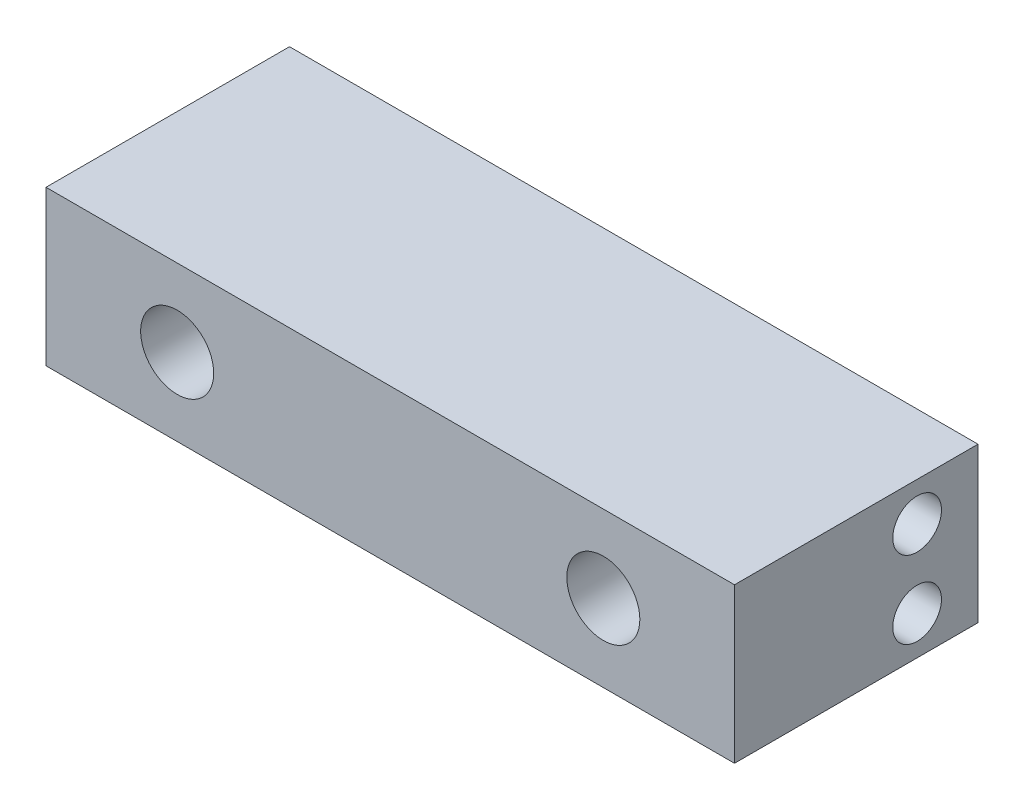
ISO-10303-21;
HEADER;
FILE_DESCRIPTION(('STEP AP214'),'2;1');
FILE_NAME('part.step','',(''),(''),'','','');
FILE_SCHEMA(('AUTOMOTIVE_DESIGN { 1 0 10303 214 1 1 1 1 }'));
ENDSEC;
DATA;
#1=APPLICATION_CONTEXT('core data for automotive mechanical design processes');
#2=APPLICATION_PROTOCOL_DEFINITION('international standard','automotive_design',2000,#1);
#3=PRODUCT_CONTEXT('',#1,'mechanical');
#4=PRODUCT('Part','Part','',(#3));
#5=PRODUCT_RELATED_PRODUCT_CATEGORY('part','',(#4));
#6=PRODUCT_DEFINITION_FORMATION('','',#4);
#7=PRODUCT_DEFINITION_CONTEXT('part definition',#1,'design');
#8=PRODUCT_DEFINITION('design','',#6,#7);
#9=PRODUCT_DEFINITION_SHAPE('','',#8);
#10=(LENGTH_UNIT() NAMED_UNIT(*) SI_UNIT(.MILLI.,.METRE.));
#11=(NAMED_UNIT(*) PLANE_ANGLE_UNIT() SI_UNIT($,.RADIAN.));
#12=(NAMED_UNIT(*) SI_UNIT($,.STERADIAN.) SOLID_ANGLE_UNIT());
#13=UNCERTAINTY_MEASURE_WITH_UNIT(LENGTH_MEASURE(1.E-05),#10,'distance_accuracy_value','');
#14=(GEOMETRIC_REPRESENTATION_CONTEXT(3) GLOBAL_UNCERTAINTY_ASSIGNED_CONTEXT((#13)) GLOBAL_UNIT_ASSIGNED_CONTEXT((#10,
#11,#12)) REPRESENTATION_CONTEXT('',''));
#15=CARTESIAN_POINT('',(0.,0.,0.));
#16=DIRECTION('',(0.,0.,1.));
#17=DIRECTION('',(1.,0.,0.));
#18=AXIS2_PLACEMENT_3D('',#15,#16,#17);
#19=CARTESIAN_POINT('',(-28.275,6.35,20.));
#20=DIRECTION('',(0.,1.,0.));
#21=DIRECTION('',(0.,0.,1.));
#22=AXIS2_PLACEMENT_3D('',#19,#20,#21);
#23=PLANE('',#22);
#24=DIRECTION('',(1.,0.,0.));
#25=VECTOR('',#24,1.);
#26=CARTESIAN_POINT('',(-28.275,6.35,0.));
#27=LINE('',#26,#25);
#28=CARTESIAN_POINT('',(-28.275,6.35,0.));
#29=VERTEX_POINT('',#28);
#30=CARTESIAN_POINT('',(28.275,6.35,0.));
#31=VERTEX_POINT('',#30);
#32=EDGE_CURVE('E103',#29,#31,#27,.T.);
#33=ORIENTED_EDGE('',*,*,#32,.F.);
#34=DIRECTION('',(0.,0.,-1.));
#35=VECTOR('',#34,1.);
#36=CARTESIAN_POINT('',(-28.275,6.35,20.));
#37=LINE('',#36,#35);
#38=CARTESIAN_POINT('',(-28.275,6.35,20.));
#39=VERTEX_POINT('',#38);
#40=EDGE_CURVE('E11',#39,#29,#37,.T.);
#41=ORIENTED_EDGE('',*,*,#40,.F.);
#42=DIRECTION('',(1.,0.,0.));
#43=VECTOR('',#42,1.);
#44=CARTESIAN_POINT('',(-28.275,6.35,20.));
#45=LINE('',#44,#43);
#46=CARTESIAN_POINT('',(28.275,6.35,20.));
#47=VERTEX_POINT('',#46);
#48=EDGE_CURVE('E97',#39,#47,#45,.T.);
#49=ORIENTED_EDGE('',*,*,#48,.T.);
#50=DIRECTION('',(0.,0.,-1.));
#51=VECTOR('',#50,1.);
#52=CARTESIAN_POINT('',(28.275,6.35,20.));
#53=LINE('',#52,#51);
#54=EDGE_CURVE('E40',#47,#31,#53,.T.);
#55=ORIENTED_EDGE('',*,*,#54,.T.);
#56=EDGE_LOOP('',(#33,#41,#49,#55));
#57=FACE_BOUND('',#56,.T.);
#58=ADVANCED_FACE('F37',(#57),#23,.T.);
#59=CARTESIAN_POINT('',(-28.275,6.35,20.));
#60=DIRECTION('',(1.,0.,0.));
#61=DIRECTION('',(0.,0.,-1.));
#62=AXIS2_PLACEMENT_3D('',#59,#60,#61);
#63=PLANE('',#62);
#64=CARTESIAN_POINT('',(-28.275,3.175,5.));
#65=DIRECTION('',(-1.,0.,0.));
#66=DIRECTION('',(0.,-1.,0.));
#67=AXIS2_PLACEMENT_3D('',#64,#65,#66);
#68=CIRCLE('',#67,2.);
#69=CARTESIAN_POINT('',(-28.275,1.175,5.));
#70=VERTEX_POINT('',#69);
#71=EDGE_CURVE('E152',#70,#70,#68,.T.);
#72=ORIENTED_EDGE('',*,*,#71,.F.);
#73=EDGE_LOOP('',(#72));
#74=FACE_BOUND('',#73,.T.);
#75=CARTESIAN_POINT('',(-28.275,-3.175,5.));
#76=DIRECTION('',(-1.,0.,0.));
#77=DIRECTION('',(0.,-1.,0.));
#78=AXIS2_PLACEMENT_3D('',#75,#76,#77);
#79=CIRCLE('',#78,2.);
#80=CARTESIAN_POINT('',(-28.275,-5.175,5.));
#81=VERTEX_POINT('',#80);
#82=EDGE_CURVE('E158',#81,#81,#79,.T.);
#83=ORIENTED_EDGE('',*,*,#82,.F.);
#84=EDGE_LOOP('',(#83));
#85=FACE_BOUND('',#84,.T.);
#86=DIRECTION('',(0.,-1.,0.));
#87=VECTOR('',#86,1.);
#88=CARTESIAN_POINT('',(-28.275,6.35,0.));
#89=LINE('',#88,#87);
#90=CARTESIAN_POINT('',(-28.275,-6.35,0.));
#91=VERTEX_POINT('',#90);
#92=EDGE_CURVE('E70',#29,#91,#89,.T.);
#93=ORIENTED_EDGE('',*,*,#92,.T.);
#94=DIRECTION('',(0.,0.,-1.));
#95=VECTOR('',#94,1.);
#96=CARTESIAN_POINT('',(-28.275,-6.35,20.));
#97=LINE('',#96,#95);
#98=CARTESIAN_POINT('',(-28.275,-6.35,20.));
#99=VERTEX_POINT('',#98);
#100=EDGE_CURVE('E46',#99,#91,#97,.T.);
#101=ORIENTED_EDGE('',*,*,#100,.F.);
#102=DIRECTION('',(0.,-1.,0.));
#103=VECTOR('',#102,1.);
#104=CARTESIAN_POINT('',(-28.275,6.35,20.));
#105=LINE('',#104,#103);
#106=EDGE_CURVE('E87',#39,#99,#105,.T.);
#107=ORIENTED_EDGE('',*,*,#106,.F.);
#108=ORIENTED_EDGE('',*,*,#40,.T.);
#109=EDGE_LOOP('',(#93,#101,#107,#108));
#110=FACE_BOUND('',#109,.T.);
#111=ADVANCED_FACE('F114',(#74,#85,#110),#63,.F.);
#112=CARTESIAN_POINT('',(-28.275,-6.35,20.));
#113=DIRECTION('',(0.,1.,0.));
#114=DIRECTION('',(0.,0.,1.));
#115=AXIS2_PLACEMENT_3D('',#112,#113,#114);
#116=PLANE('',#115);
#117=DIRECTION('',(1.,0.,0.));
#118=VECTOR('',#117,1.);
#119=CARTESIAN_POINT('',(-28.275,-6.35,0.));
#120=LINE('',#119,#118);
#121=CARTESIAN_POINT('',(28.275,-6.35,0.));
#122=VERTEX_POINT('',#121);
#123=EDGE_CURVE('E94',#91,#122,#120,.T.);
#124=ORIENTED_EDGE('',*,*,#123,.T.);
#125=DIRECTION('',(0.,0.,-1.));
#126=VECTOR('',#125,1.);
#127=CARTESIAN_POINT('',(28.275,-6.35,20.));
#128=LINE('',#127,#126);
#129=CARTESIAN_POINT('',(28.275,-6.35,20.));
#130=VERTEX_POINT('',#129);
#131=EDGE_CURVE('E91',#130,#122,#128,.T.);
#132=ORIENTED_EDGE('',*,*,#131,.F.);
#133=DIRECTION('',(1.,0.,0.));
#134=VECTOR('',#133,1.);
#135=CARTESIAN_POINT('',(-28.275,-6.35,20.));
#136=LINE('',#135,#134);
#137=EDGE_CURVE('E82',#99,#130,#136,.T.);
#138=ORIENTED_EDGE('',*,*,#137,.F.);
#139=ORIENTED_EDGE('',*,*,#100,.T.);
#140=EDGE_LOOP('',(#124,#132,#138,#139));
#141=FACE_BOUND('',#140,.T.);
#142=ADVANCED_FACE('F92',(#141),#116,.F.);
#143=CARTESIAN_POINT('',(28.275,6.35,20.));
#144=DIRECTION('',(1.,0.,0.));
#145=DIRECTION('',(0.,1.,0.));
#146=AXIS2_PLACEMENT_3D('',#143,#144,#145);
#147=PLANE('',#146);
#148=CARTESIAN_POINT('',(28.275,3.175,5.));
#149=DIRECTION('',(-1.,0.,0.));
#150=DIRECTION('',(0.,-1.,0.));
#151=AXIS2_PLACEMENT_3D('',#148,#149,#150);
#152=CIRCLE('',#151,2.);
#153=CARTESIAN_POINT('',(28.275,1.175,5.));
#154=VERTEX_POINT('',#153);
#155=EDGE_CURVE('E137',#154,#154,#152,.T.);
#156=ORIENTED_EDGE('',*,*,#155,.T.);
#157=EDGE_LOOP('',(#156));
#158=FACE_BOUND('',#157,.T.);
#159=CARTESIAN_POINT('',(28.275,-3.175,5.));
#160=DIRECTION('',(-1.,0.,0.));
#161=DIRECTION('',(0.,-1.,0.));
#162=AXIS2_PLACEMENT_3D('',#159,#160,#161);
#163=CIRCLE('',#162,2.);
#164=CARTESIAN_POINT('',(28.275,-5.175,5.));
#165=VERTEX_POINT('',#164);
#166=EDGE_CURVE('E140',#165,#165,#163,.T.);
#167=ORIENTED_EDGE('',*,*,#166,.T.);
#168=EDGE_LOOP('',(#167));
#169=FACE_BOUND('',#168,.T.);
#170=DIRECTION('',(0.,-1.,0.));
#171=VECTOR('',#170,1.);
#172=CARTESIAN_POINT('',(28.275,6.35,0.));
#173=LINE('',#172,#171);
#174=EDGE_CURVE('E106',#31,#122,#173,.T.);
#175=ORIENTED_EDGE('',*,*,#174,.F.);
#176=ORIENTED_EDGE('',*,*,#54,.F.);
#177=DIRECTION('',(0.,-1.,0.));
#178=VECTOR('',#177,1.);
#179=CARTESIAN_POINT('',(28.275,6.35,20.));
#180=LINE('',#179,#178);
#181=EDGE_CURVE('E86',#47,#130,#180,.T.);
#182=ORIENTED_EDGE('',*,*,#181,.T.);
#183=ORIENTED_EDGE('',*,*,#131,.T.);
#184=EDGE_LOOP('',(#175,#176,#182,#183));
#185=FACE_BOUND('',#184,.T.);
#186=ADVANCED_FACE('F96',(#158,#169,#185),#147,.T.);
#187=CARTESIAN_POINT('',(0.,0.,20.));
#188=DIRECTION('',(0.,0.,-1.));
#189=DIRECTION('',(-1.,0.,0.));
#190=AXIS2_PLACEMENT_3D('',#187,#188,#189);
#191=PLANE('',#190);
#192=CARTESIAN_POINT('',(-17.5,0.,20.));
#193=DIRECTION('',(0.,0.,1.));
#194=DIRECTION('',(1.,0.,0.));
#195=AXIS2_PLACEMENT_3D('',#192,#193,#194);
#196=CIRCLE('',#195,3.);
#197=CARTESIAN_POINT('',(-14.5,0.,20.));
#198=VERTEX_POINT('',#197);
#199=EDGE_CURVE('E164',#198,#198,#196,.T.);
#200=ORIENTED_EDGE('',*,*,#199,.F.);
#201=EDGE_LOOP('',(#200));
#202=FACE_BOUND('',#201,.T.);
#203=CARTESIAN_POINT('',(17.5,0.,20.));
#204=DIRECTION('',(0.,0.,1.));
#205=DIRECTION('',(1.,0.,0.));
#206=AXIS2_PLACEMENT_3D('',#203,#204,#205);
#207=CIRCLE('',#206,3.);
#208=CARTESIAN_POINT('',(20.5,0.,20.));
#209=VERTEX_POINT('',#208);
#210=EDGE_CURVE('E151',#209,#209,#207,.T.);
#211=ORIENTED_EDGE('',*,*,#210,.F.);
#212=EDGE_LOOP('',(#211));
#213=FACE_BOUND('',#212,.T.);
#214=ORIENTED_EDGE('',*,*,#48,.F.);
#215=ORIENTED_EDGE('',*,*,#106,.T.);
#216=ORIENTED_EDGE('',*,*,#137,.T.);
#217=ORIENTED_EDGE('',*,*,#181,.F.);
#218=EDGE_LOOP('',(#214,#215,#216,#217));
#219=FACE_BOUND('',#218,.T.);
#220=ADVANCED_FACE('F85',(#202,#213,#219),#191,.F.);
#221=CARTESIAN_POINT('',(0.,0.,0.));
#222=DIRECTION('',(0.,0.,-1.));
#223=DIRECTION('',(-1.,0.,0.));
#224=AXIS2_PLACEMENT_3D('',#221,#222,#223);
#225=PLANE('',#224);
#226=ORIENTED_EDGE('',*,*,#32,.T.);
#227=ORIENTED_EDGE('',*,*,#174,.T.);
#228=ORIENTED_EDGE('',*,*,#123,.F.);
#229=ORIENTED_EDGE('',*,*,#92,.F.);
#230=EDGE_LOOP('',(#226,#227,#228,#229));
#231=FACE_BOUND('',#230,.T.);
#232=ADVANCED_FACE('F112',(#231),#225,.T.);
#233=CARTESIAN_POINT('',(17.5,0.,8.));
#234=DIRECTION('',(0.,0.,1.));
#235=DIRECTION('',(1.,0.,0.));
#236=AXIS2_PLACEMENT_3D('',#233,#234,#235);
#237=CYLINDRICAL_SURFACE('',#236,3.);
#238=CARTESIAN_POINT('',(17.5,0.,8.));
#239=DIRECTION('',(0.,0.,1.));
#240=DIRECTION('',(1.,0.,0.));
#241=AXIS2_PLACEMENT_3D('',#238,#239,#240);
#242=CIRCLE('',#241,3.);
#243=CARTESIAN_POINT('',(20.5,0.,8.));
#244=VERTEX_POINT('',#243);
#245=EDGE_CURVE('E167',#244,#244,#242,.T.);
#246=ORIENTED_EDGE('',*,*,#245,.F.);
#247=EDGE_LOOP('',(#246));
#248=FACE_BOUND('',#247,.T.);
#249=ORIENTED_EDGE('',*,*,#210,.T.);
#250=EDGE_LOOP('',(#249));
#251=FACE_BOUND('',#250,.T.);
#252=ADVANCED_FACE('F172',(#248,#251),#237,.F.);
#253=CARTESIAN_POINT('',(0.,0.,8.));
#254=DIRECTION('',(0.,0.,1.));
#255=DIRECTION('',(1.,0.,0.));
#256=AXIS2_PLACEMENT_3D('',#253,#254,#255);
#257=PLANE('',#256);
#258=ORIENTED_EDGE('',*,*,#245,.T.);
#259=EDGE_LOOP('',(#258));
#260=FACE_BOUND('',#259,.T.);
#261=ADVANCED_FACE('F175',(#260),#257,.T.);
#262=CARTESIAN_POINT('',(-17.5,0.,8.));
#263=DIRECTION('',(0.,0.,1.));
#264=DIRECTION('',(1.,0.,0.));
#265=AXIS2_PLACEMENT_3D('',#262,#263,#264);
#266=CYLINDRICAL_SURFACE('',#265,3.);
#267=CARTESIAN_POINT('',(-17.5,0.,8.));
#268=DIRECTION('',(0.,0.,1.));
#269=DIRECTION('',(1.,0.,0.));
#270=AXIS2_PLACEMENT_3D('',#267,#268,#269);
#271=CIRCLE('',#270,3.);
#272=CARTESIAN_POINT('',(-14.5,0.,8.));
#273=VERTEX_POINT('',#272);
#274=EDGE_CURVE('E107',#273,#273,#271,.T.);
#275=ORIENTED_EDGE('',*,*,#274,.F.);
#276=EDGE_LOOP('',(#275));
#277=FACE_BOUND('',#276,.T.);
#278=ORIENTED_EDGE('',*,*,#199,.T.);
#279=EDGE_LOOP('',(#278));
#280=FACE_BOUND('',#279,.T.);
#281=ADVANCED_FACE('F182',(#277,#280),#266,.F.);
#282=CARTESIAN_POINT('',(0.,0.,8.));
#283=DIRECTION('',(0.,0.,1.));
#284=DIRECTION('',(1.,0.,0.));
#285=AXIS2_PLACEMENT_3D('',#282,#283,#284);
#286=PLANE('',#285);
#287=ORIENTED_EDGE('',*,*,#274,.T.);
#288=EDGE_LOOP('',(#287));
#289=FACE_BOUND('',#288,.T.);
#290=ADVANCED_FACE('F189',(#289),#286,.T.);
#291=CARTESIAN_POINT('',(-14.275,-3.175,5.));
#292=DIRECTION('',(-1.,0.,0.));
#293=DIRECTION('',(0.,-1.,0.));
#294=AXIS2_PLACEMENT_3D('',#291,#292,#293);
#295=CYLINDRICAL_SURFACE('',#294,2.);
#296=CARTESIAN_POINT('',(-14.275,-3.175,5.));
#297=DIRECTION('',(-1.,0.,0.));
#298=DIRECTION('',(0.,-1.,0.));
#299=AXIS2_PLACEMENT_3D('',#296,#297,#298);
#300=CIRCLE('',#299,2.);
#301=CARTESIAN_POINT('',(-14.275,-5.175,5.));
#302=VERTEX_POINT('',#301);
#303=EDGE_CURVE('E155',#302,#302,#300,.T.);
#304=ORIENTED_EDGE('',*,*,#303,.F.);
#305=EDGE_LOOP('',(#304));
#306=FACE_BOUND('',#305,.T.);
#307=ORIENTED_EDGE('',*,*,#82,.T.);
#308=EDGE_LOOP('',(#307));
#309=FACE_BOUND('',#308,.T.);
#310=ADVANCED_FACE('F193',(#306,#309),#295,.F.);
#311=CARTESIAN_POINT('',(-14.275,0.,0.));
#312=DIRECTION('',(-1.,0.,0.));
#313=DIRECTION('',(0.,-1.,0.));
#314=AXIS2_PLACEMENT_3D('',#311,#312,#313);
#315=PLANE('',#314);
#316=ORIENTED_EDGE('',*,*,#303,.T.);
#317=EDGE_LOOP('',(#316));
#318=FACE_BOUND('',#317,.T.);
#319=ADVANCED_FACE('F197',(#318),#315,.T.);
#320=CARTESIAN_POINT('',(-14.275,3.175,5.));
#321=DIRECTION('',(-1.,0.,0.));
#322=DIRECTION('',(0.,-1.,0.));
#323=AXIS2_PLACEMENT_3D('',#320,#321,#322);
#324=CYLINDRICAL_SURFACE('',#323,2.);
#325=CARTESIAN_POINT('',(-14.275,3.175,5.));
#326=DIRECTION('',(-1.,0.,0.));
#327=DIRECTION('',(0.,-1.,0.));
#328=AXIS2_PLACEMENT_3D('',#325,#326,#327);
#329=CIRCLE('',#328,2.);
#330=CARTESIAN_POINT('',(-14.275,1.175,5.));
#331=VERTEX_POINT('',#330);
#332=EDGE_CURVE('E148',#331,#331,#329,.T.);
#333=ORIENTED_EDGE('',*,*,#332,.F.);
#334=EDGE_LOOP('',(#333));
#335=FACE_BOUND('',#334,.T.);
#336=ORIENTED_EDGE('',*,*,#71,.T.);
#337=EDGE_LOOP('',(#336));
#338=FACE_BOUND('',#337,.T.);
#339=ADVANCED_FACE('F201',(#335,#338),#324,.F.);
#340=CARTESIAN_POINT('',(-14.275,0.,0.));
#341=DIRECTION('',(-1.,0.,0.));
#342=DIRECTION('',(0.,-1.,0.));
#343=AXIS2_PLACEMENT_3D('',#340,#341,#342);
#344=PLANE('',#343);
#345=ORIENTED_EDGE('',*,*,#332,.T.);
#346=EDGE_LOOP('',(#345));
#347=FACE_BOUND('',#346,.T.);
#348=ADVANCED_FACE('F205',(#347),#344,.T.);
#349=CARTESIAN_POINT('',(14.275,-3.175,5.));
#350=DIRECTION('',(1.,0.,0.));
#351=DIRECTION('',(0.,1.,0.));
#352=AXIS2_PLACEMENT_3D('',#349,#350,#351);
#353=CYLINDRICAL_SURFACE('',#352,2.);
#354=CARTESIAN_POINT('',(14.275,-3.175,5.));
#355=DIRECTION('',(-1.,0.,0.));
#356=DIRECTION('',(0.,-1.,0.));
#357=AXIS2_PLACEMENT_3D('',#354,#355,#356);
#358=CIRCLE('',#357,2.);
#359=CARTESIAN_POINT('',(14.275,-5.175,5.));
#360=VERTEX_POINT('',#359);
#361=EDGE_CURVE('E142',#360,#360,#358,.T.);
#362=ORIENTED_EDGE('',*,*,#361,.T.);
#363=EDGE_LOOP('',(#362));
#364=FACE_BOUND('',#363,.T.);
#365=ORIENTED_EDGE('',*,*,#166,.F.);
#366=EDGE_LOOP('',(#365));
#367=FACE_BOUND('',#366,.T.);
#368=ADVANCED_FACE('F209',(#364,#367),#353,.F.);
#369=CARTESIAN_POINT('',(14.275,0.,0.));
#370=DIRECTION('',(1.,0.,0.));
#371=DIRECTION('',(0.,-1.,0.));
#372=AXIS2_PLACEMENT_3D('',#369,#370,#371);
#373=PLANE('',#372);
#374=ORIENTED_EDGE('',*,*,#361,.F.);
#375=EDGE_LOOP('',(#374));
#376=FACE_BOUND('',#375,.T.);
#377=ADVANCED_FACE('F213',(#376),#373,.T.);
#378=CARTESIAN_POINT('',(14.275,3.175,5.));
#379=DIRECTION('',(1.,0.,0.));
#380=DIRECTION('',(0.,1.,0.));
#381=AXIS2_PLACEMENT_3D('',#378,#379,#380);
#382=CYLINDRICAL_SURFACE('',#381,2.);
#383=CARTESIAN_POINT('',(14.275,3.175,5.));
#384=DIRECTION('',(-1.,0.,0.));
#385=DIRECTION('',(0.,-1.,0.));
#386=AXIS2_PLACEMENT_3D('',#383,#384,#385);
#387=CIRCLE('',#386,2.);
#388=CARTESIAN_POINT('',(14.275,1.175,5.));
#389=VERTEX_POINT('',#388);
#390=EDGE_CURVE('E161',#389,#389,#387,.T.);
#391=ORIENTED_EDGE('',*,*,#390,.T.);
#392=EDGE_LOOP('',(#391));
#393=FACE_BOUND('',#392,.T.);
#394=ORIENTED_EDGE('',*,*,#155,.F.);
#395=EDGE_LOOP('',(#394));
#396=FACE_BOUND('',#395,.T.);
#397=ADVANCED_FACE('F217',(#393,#396),#382,.F.);
#398=CARTESIAN_POINT('',(14.275,0.,0.));
#399=DIRECTION('',(1.,0.,0.));
#400=DIRECTION('',(0.,-1.,0.));
#401=AXIS2_PLACEMENT_3D('',#398,#399,#400);
#402=PLANE('',#401);
#403=ORIENTED_EDGE('',*,*,#390,.F.);
#404=EDGE_LOOP('',(#403));
#405=FACE_BOUND('',#404,.T.);
#406=ADVANCED_FACE('F221',(#405),#402,.T.);
#407=CLOSED_SHELL('',(#58,#111,#142,#186,#220,#232,#252,#261,#281,#290,#310,#319,#339,#348,#368,
#377,#397,#406));
#408=MANIFOLD_SOLID_BREP('B2',#407);
#409=ADVANCED_BREP_SHAPE_REPRESENTATION('',(#18,#408),#14);
#410=SHAPE_DEFINITION_REPRESENTATION(#9,#409);
ENDSEC;
END-ISO-10303-21;
